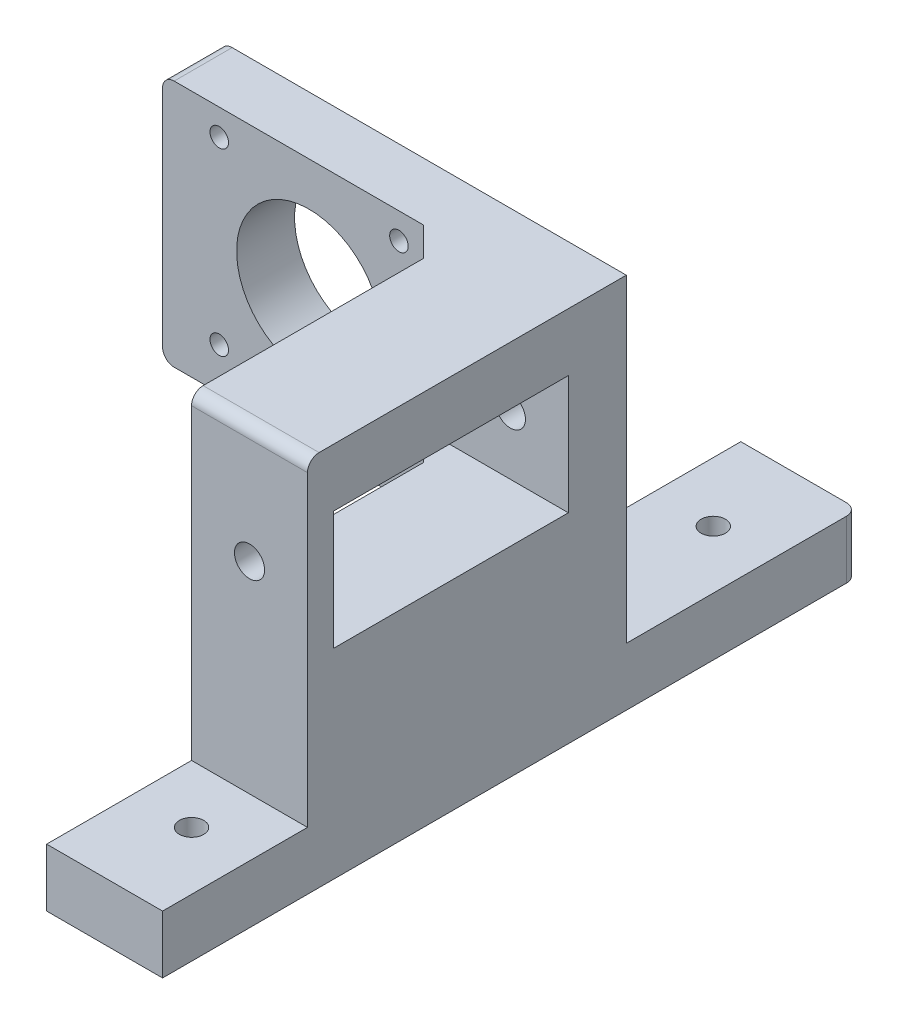
ISO-10303-21;
HEADER;
FILE_DESCRIPTION(('STEP AP214'),'2;1');
FILE_NAME('part.step','',(''),(''),'','','');
FILE_SCHEMA(('AUTOMOTIVE_DESIGN { 1 0 10303 214 1 1 1 1 }'));
ENDSEC;
DATA;
#1=APPLICATION_CONTEXT('core data for automotive mechanical design processes');
#2=APPLICATION_PROTOCOL_DEFINITION('international standard','automotive_design',2000,#1);
#3=PRODUCT_CONTEXT('',#1,'mechanical');
#4=PRODUCT('Part','Part','',(#3));
#5=PRODUCT_RELATED_PRODUCT_CATEGORY('part','',(#4));
#6=PRODUCT_DEFINITION_FORMATION('','',#4);
#7=PRODUCT_DEFINITION_CONTEXT('part definition',#1,'design');
#8=PRODUCT_DEFINITION('design','',#6,#7);
#9=PRODUCT_DEFINITION_SHAPE('','',#8);
#10=(LENGTH_UNIT() NAMED_UNIT(*) SI_UNIT(.MILLI.,.METRE.));
#11=(NAMED_UNIT(*) PLANE_ANGLE_UNIT() SI_UNIT($,.RADIAN.));
#12=(NAMED_UNIT(*) SI_UNIT($,.STERADIAN.) SOLID_ANGLE_UNIT());
#13=UNCERTAINTY_MEASURE_WITH_UNIT(LENGTH_MEASURE(1.E-05),#10,'distance_accuracy_value','');
#14=(GEOMETRIC_REPRESENTATION_CONTEXT(3) GLOBAL_UNCERTAINTY_ASSIGNED_CONTEXT((#13)) GLOBAL_UNIT_ASSIGNED_CONTEXT((#10,
#11,#12)) REPRESENTATION_CONTEXT('',''));
#15=CARTESIAN_POINT('',(0.,0.,0.));
#16=DIRECTION('',(0.,0.,1.));
#17=DIRECTION('',(1.,0.,0.));
#18=AXIS2_PLACEMENT_3D('',#15,#16,#17);
#19=CARTESIAN_POINT('',(20.,55.,-70.0000000000044));
#20=DIRECTION('',(0.,0.,-1.));
#21=DIRECTION('',(-1.,0.,0.));
#22=AXIS2_PLACEMENT_3D('',#19,#20,#21);
#23=PLANE('',#22);
#24=CARTESIAN_POINT('',(10.,44.75,-70.0000000000044));
#25=DIRECTION('',(0.,0.,-1.));
#26=DIRECTION('',(-1.,0.,0.));
#27=AXIS2_PLACEMENT_3D('',#24,#25,#26);
#28=CIRCLE('',#27,2.6);
#29=CARTESIAN_POINT('',(7.4,44.75,-70.0000000000044));
#30=VERTEX_POINT('',#29);
#31=EDGE_CURVE('E305',#30,#30,#28,.T.);
#32=ORIENTED_EDGE('',*,*,#31,.T.);
#33=EDGE_LOOP('',(#32));
#34=FACE_BOUND('',#33,.T.);
#35=CARTESIAN_POINT('',(-24.7252844500361,45.0002193563905,-70.0000000000044));
#36=DIRECTION('',(0.,0.,1.));
#37=DIRECTION('',(1.,0.,0.));
#38=AXIS2_PLACEMENT_3D('',#35,#36,#37);
#39=CIRCLE('',#38,12.5);
#40=CARTESIAN_POINT('',(-12.2252844500361,45.0002193563905,-70.0000000000044));
#41=VERTEX_POINT('',#40);
#42=EDGE_CURVE('E516',#41,#41,#39,.T.);
#43=ORIENTED_EDGE('',*,*,#42,.F.);
#44=EDGE_LOOP('',(#43));
#45=FACE_BOUND('',#44,.T.);
#46=CARTESIAN_POINT('',(-9.2252844500361,60.5002193563905,-70.0000000000044));
#47=DIRECTION('',(0.,0.,1.));
#48=DIRECTION('',(1.,0.,0.));
#49=AXIS2_PLACEMENT_3D('',#46,#47,#48);
#50=CIRCLE('',#49,1.6);
#51=CARTESIAN_POINT('',(-7.6252844500361,60.5002193563905,-70.0000000000044));
#52=VERTEX_POINT('',#51);
#53=EDGE_CURVE('E509',#52,#52,#50,.T.);
#54=ORIENTED_EDGE('',*,*,#53,.F.);
#55=EDGE_LOOP('',(#54));
#56=FACE_BOUND('',#55,.T.);
#57=CARTESIAN_POINT('',(-9.2252844500361,29.5002193563905,-70.0000000000044));
#58=DIRECTION('',(0.,0.,1.));
#59=DIRECTION('',(1.,0.,0.));
#60=AXIS2_PLACEMENT_3D('',#57,#58,#59);
#61=CIRCLE('',#60,1.6);
#62=CARTESIAN_POINT('',(-7.6252844500361,29.5002193563905,-70.0000000000044));
#63=VERTEX_POINT('',#62);
#64=EDGE_CURVE('E517',#63,#63,#61,.T.);
#65=ORIENTED_EDGE('',*,*,#64,.F.);
#66=EDGE_LOOP('',(#65));
#67=FACE_BOUND('',#66,.T.);
#68=CARTESIAN_POINT('',(-40.2252844500361,29.5002193563905,-70.0000000000044));
#69=DIRECTION('',(0.,0.,1.));
#70=DIRECTION('',(1.,0.,0.));
#71=AXIS2_PLACEMENT_3D('',#68,#69,#70);
#72=CIRCLE('',#71,1.6);
#73=CARTESIAN_POINT('',(-38.6252844500361,29.5002193563905,-70.0000000000044));
#74=VERTEX_POINT('',#73);
#75=EDGE_CURVE('E523',#74,#74,#72,.T.);
#76=ORIENTED_EDGE('',*,*,#75,.F.);
#77=EDGE_LOOP('',(#76));
#78=FACE_BOUND('',#77,.T.);
#79=CARTESIAN_POINT('',(-40.2252844500361,60.5002193563905,-70.0000000000044));
#80=DIRECTION('',(0.,0.,1.));
#81=DIRECTION('',(1.,0.,0.));
#82=AXIS2_PLACEMENT_3D('',#79,#80,#81);
#83=CIRCLE('',#82,1.6);
#84=CARTESIAN_POINT('',(-38.6252844500361,60.5002193563905,-70.0000000000044));
#85=VERTEX_POINT('',#84);
#86=EDGE_CURVE('E506',#85,#85,#83,.T.);
#87=ORIENTED_EDGE('',*,*,#86,.F.);
#88=EDGE_LOOP('',(#87));
#89=FACE_BOUND('',#88,.T.);
#90=DIRECTION('',(0.707106781186551,-0.707106781186544,0.));
#91=VECTOR('',#90,1.);
#92=CARTESIAN_POINT('',(-12.6249999999999,22.3749999999998,-70.0000000000044));
#93=LINE('',#92,#91);
#94=CARTESIAN_POINT('',(-12.5000000000001,22.25,-70.0000000000044));
#95=VERTEX_POINT('',#94);
#96=CARTESIAN_POINT('',(-5.00000000000003,14.75,-70.0000000000044));
#97=VERTEX_POINT('',#96);
#98=EDGE_CURVE('E310',#95,#97,#93,.T.);
#99=ORIENTED_EDGE('',*,*,#98,.T.);
#100=DIRECTION('',(0.,1.,0.));
#101=VECTOR('',#100,1.);
#102=CARTESIAN_POINT('',(-5.00000000000003,34.5,-70.0000000000044));
#103=LINE('',#102,#101);
#104=CARTESIAN_POINT('',(-5.00000000000003,34.5,-70.0000000000044));
#105=VERTEX_POINT('',#104);
#106=EDGE_CURVE('E208',#97,#105,#103,.T.);
#107=ORIENTED_EDGE('',*,*,#106,.T.);
#108=DIRECTION('',(-1.,0.,0.));
#109=VECTOR('',#108,1.);
#110=CARTESIAN_POINT('',(20.,34.5,-70.0000000000044));
#111=LINE('',#110,#109);
#112=CARTESIAN_POINT('',(20.,34.5,-70.0000000000044));
#113=VERTEX_POINT('',#112);
#114=EDGE_CURVE('E201',#113,#105,#111,.T.);
#115=ORIENTED_EDGE('',*,*,#114,.F.);
#116=DIRECTION('',(0.,-1.,0.));
#117=VECTOR('',#116,1.);
#118=CARTESIAN_POINT('',(20.,55.,-70.0000000000044));
#119=LINE('',#118,#117);
#120=CARTESIAN_POINT('',(20.,55.,-70.0000000000044));
#121=VERTEX_POINT('',#120);
#122=EDGE_CURVE('E205',#121,#113,#119,.T.);
#123=ORIENTED_EDGE('',*,*,#122,.F.);
#124=DIRECTION('',(-1.,0.,0.));
#125=VECTOR('',#124,1.);
#126=CARTESIAN_POINT('',(20.,55.,-70.0000000000044));
#127=LINE('',#126,#125);
#128=CARTESIAN_POINT('',(-5.00000000000003,55.,-70.0000000000044));
#129=VERTEX_POINT('',#128);
#130=EDGE_CURVE('E239',#121,#129,#127,.T.);
#131=ORIENTED_EDGE('',*,*,#130,.T.);
#132=DIRECTION('',(0.,1.,0.));
#133=VECTOR('',#132,1.);
#134=CARTESIAN_POINT('',(-5.00000000000003,65.,-70.0000000000044));
#135=LINE('',#134,#133);
#136=CARTESIAN_POINT('',(-5.00000000000003,65.,-70.0000000000044));
#137=VERTEX_POINT('',#136);
#138=EDGE_CURVE('E367',#129,#137,#135,.T.);
#139=ORIENTED_EDGE('',*,*,#138,.T.);
#140=DIRECTION('',(1.,0.,0.));
#141=VECTOR('',#140,1.);
#142=CARTESIAN_POINT('',(-50.,65.,-70.0000000000044));
#143=LINE('',#142,#141);
#144=CARTESIAN_POINT('',(-48.,65.,-70.0000000000044));
#145=VERTEX_POINT('',#144);
#146=EDGE_CURVE('E306',#145,#137,#143,.T.);
#147=ORIENTED_EDGE('',*,*,#146,.F.);
#148=CARTESIAN_POINT('',(-48.,63.,-70.0000000000044));
#149=DIRECTION('',(0.,0.,-1.));
#150=DIRECTION('',(-1.,0.,0.));
#151=AXIS2_PLACEMENT_3D('',#148,#149,#150);
#152=CIRCLE('',#151,2.);
#153=CARTESIAN_POINT('',(-50.,63.,-70.0000000000044));
#154=VERTEX_POINT('',#153);
#155=EDGE_CURVE('E361',#145,#154,#152,.F.);
#156=ORIENTED_EDGE('',*,*,#155,.T.);
#157=DIRECTION('',(0.,1.,0.));
#158=VECTOR('',#157,1.);
#159=CARTESIAN_POINT('',(-50.,65.,-70.0000000000044));
#160=LINE('',#159,#158);
#161=CARTESIAN_POINT('',(-50.,24.25,-70.0000000000044));
#162=VERTEX_POINT('',#161);
#163=EDGE_CURVE('E541',#162,#154,#160,.T.);
#164=ORIENTED_EDGE('',*,*,#163,.F.);
#165=CARTESIAN_POINT('',(-48.,24.25,-70.0000000000044));
#166=DIRECTION('',(0.,0.,-1.));
#167=DIRECTION('',(-1.,0.,0.));
#168=AXIS2_PLACEMENT_3D('',#165,#166,#167);
#169=CIRCLE('',#168,2.);
#170=CARTESIAN_POINT('',(-48.,22.25,-70.0000000000044));
#171=VERTEX_POINT('',#170);
#172=EDGE_CURVE('E359',#162,#171,#169,.F.);
#173=ORIENTED_EDGE('',*,*,#172,.T.);
#174=DIRECTION('',(1.,0.,0.));
#175=VECTOR('',#174,1.);
#176=CARTESIAN_POINT('',(-50.,22.25,-70.0000000000044));
#177=LINE('',#176,#175);
#178=EDGE_CURVE('E499',#171,#95,#177,.T.);
#179=ORIENTED_EDGE('',*,*,#178,.T.);
#180=EDGE_LOOP('',(#99,#107,#115,#123,#131,#139,#147,#156,#164,#173,#179));
#181=FACE_BOUND('',#180,.T.);
#182=ADVANCED_FACE('F45',(#34,#45,#56,#67,#78,#89,#181),#23,.F.);
#183=CARTESIAN_POINT('',(-50.,0.,0.));
#184=DIRECTION('',(-1.,0.,0.));
#185=DIRECTION('',(0.,0.,1.));
#186=AXIS2_PLACEMENT_3D('',#183,#184,#185);
#187=PLANE('',#186);
#188=ORIENTED_EDGE('',*,*,#163,.T.);
#189=DIRECTION('',(0.,0.,-1.));
#190=VECTOR('',#189,1.);
#191=CARTESIAN_POINT('',(-50.,63.,0.));
#192=LINE('',#191,#190);
#193=CARTESIAN_POINT('',(-50.,63.,-80.0000000000044));
#194=VERTEX_POINT('',#193);
#195=EDGE_CURVE('E352',#154,#194,#192,.T.);
#196=ORIENTED_EDGE('',*,*,#195,.T.);
#197=DIRECTION('',(0.,-1.,0.));
#198=VECTOR('',#197,1.);
#199=CARTESIAN_POINT('',(-50.,65.,-80.0000000000044));
#200=LINE('',#199,#198);
#201=CARTESIAN_POINT('',(-50.,24.25,-80.0000000000044));
#202=VERTEX_POINT('',#201);
#203=EDGE_CURVE('E538',#194,#202,#200,.T.);
#204=ORIENTED_EDGE('',*,*,#203,.T.);
#205=DIRECTION('',(0.,0.,1.));
#206=VECTOR('',#205,1.);
#207=CARTESIAN_POINT('',(-50.,24.25,0.));
#208=LINE('',#207,#206);
#209=EDGE_CURVE('E349',#202,#162,#208,.T.);
#210=ORIENTED_EDGE('',*,*,#209,.T.);
#211=EDGE_LOOP('',(#188,#196,#204,#210));
#212=FACE_BOUND('',#211,.T.);
#213=ADVANCED_FACE('F411',(#212),#187,.T.);
#214=CARTESIAN_POINT('',(0.,10.,0.));
#215=DIRECTION('',(1.,0.,0.));
#216=DIRECTION('',(0.,0.,-1.));
#217=AXIS2_PLACEMENT_3D('',#214,#215,#216);
#218=PLANE('',#217);
#219=DIRECTION('',(0.,0.,1.));
#220=VECTOR('',#219,1.);
#221=CARTESIAN_POINT('',(0.,34.5,-70.0000000000044));
#222=LINE('',#221,#220);
#223=CARTESIAN_POINT('',(0.,34.5,-65.0000000000044));
#224=VERTEX_POINT('',#223);
#225=CARTESIAN_POINT('',(0.,34.5,-29.5000000000044));
#226=VERTEX_POINT('',#225);
#227=EDGE_CURVE('E235',#224,#226,#222,.T.);
#228=ORIENTED_EDGE('',*,*,#227,.F.);
#229=DIRECTION('',(0.,-1.,0.));
#230=VECTOR('',#229,1.);
#231=CARTESIAN_POINT('',(0.,9.75000000000004,-65.0000000000044));
#232=LINE('',#231,#230);
#233=CARTESIAN_POINT('',(0.,9.75000000000004,-65.0000000000044));
#234=VERTEX_POINT('',#233);
#235=EDGE_CURVE('E373',#224,#234,#232,.T.);
#236=ORIENTED_EDGE('',*,*,#235,.T.);
#237=DIRECTION('',(0.,0.,-1.));
#238=VECTOR('',#237,1.);
#239=CARTESIAN_POINT('',(0.,9.75000000000004,0.));
#240=LINE('',#239,#238);
#241=CARTESIAN_POINT('',(0.,9.75000000000004,-118.));
#242=VERTEX_POINT('',#241);
#243=EDGE_CURVE('E61',#234,#242,#240,.T.);
#244=ORIENTED_EDGE('',*,*,#243,.T.);
#245=DIRECTION('',(0.,-1.,0.));
#246=VECTOR('',#245,1.);
#247=CARTESIAN_POINT('',(0.,10.,-118.));
#248=LINE('',#247,#246);
#249=CARTESIAN_POINT('',(0.,0.,-118.));
#250=VERTEX_POINT('',#249);
#251=EDGE_CURVE('E339',#242,#250,#248,.T.);
#252=ORIENTED_EDGE('',*,*,#251,.T.);
#253=DIRECTION('',(0.,0.,1.));
#254=VECTOR('',#253,1.);
#255=CARTESIAN_POINT('',(0.,0.,0.));
#256=LINE('',#255,#254);
#257=CARTESIAN_POINT('',(0.,0.,0.));
#258=VERTEX_POINT('',#257);
#259=EDGE_CURVE('E267',#250,#258,#256,.T.);
#260=ORIENTED_EDGE('',*,*,#259,.T.);
#261=DIRECTION('',(0.,-1.,0.));
#262=VECTOR('',#261,1.);
#263=CARTESIAN_POINT('',(0.,10.,0.));
#264=LINE('',#263,#262);
#265=CARTESIAN_POINT('',(0.,10.,0.));
#266=VERTEX_POINT('',#265);
#267=EDGE_CURVE('E298',#266,#258,#264,.T.);
#268=ORIENTED_EDGE('',*,*,#267,.F.);
#269=DIRECTION('',(0.,0.,1.));
#270=VECTOR('',#269,1.);
#271=CARTESIAN_POINT('',(0.,10.,0.));
#272=LINE('',#271,#270);
#273=CARTESIAN_POINT('',(0.,10.,-25.0000000000044));
#274=VERTEX_POINT('',#273);
#275=EDGE_CURVE('E276',#274,#266,#272,.T.);
#276=ORIENTED_EDGE('',*,*,#275,.F.);
#277=DIRECTION('',(0.,-1.,0.));
#278=VECTOR('',#277,1.);
#279=CARTESIAN_POINT('',(0.,65.,-25.0000000000044));
#280=LINE('',#279,#278);
#281=CARTESIAN_POINT('',(0.,63.,-25.0000000000044));
#282=VERTEX_POINT('',#281);
#283=EDGE_CURVE('E258',#282,#274,#280,.T.);
#284=ORIENTED_EDGE('',*,*,#283,.F.);
#285=CARTESIAN_POINT('',(0.,63.,-27.0000000000044));
#286=DIRECTION('',(1.,0.,0.));
#287=DIRECTION('',(0.,0.,-1.));
#288=AXIS2_PLACEMENT_3D('',#285,#286,#287);
#289=CIRCLE('',#288,2.);
#290=CARTESIAN_POINT('',(0.,65.,-27.0000000000044));
#291=VERTEX_POINT('',#290);
#292=EDGE_CURVE('E336',#282,#291,#289,.F.);
#293=ORIENTED_EDGE('',*,*,#292,.T.);
#294=DIRECTION('',(0.,0.,1.));
#295=VECTOR('',#294,1.);
#296=CARTESIAN_POINT('',(0.,65.,-25.0000000000044));
#297=LINE('',#296,#295);
#298=CARTESIAN_POINT('',(0.,65.,-65.0000000000044));
#299=VERTEX_POINT('',#298);
#300=EDGE_CURVE('E251',#299,#291,#297,.T.);
#301=ORIENTED_EDGE('',*,*,#300,.F.);
#302=DIRECTION('',(0.,-1.,0.));
#303=VECTOR('',#302,1.);
#304=CARTESIAN_POINT('',(0.,55.,-65.0000000000044));
#305=LINE('',#304,#303);
#306=CARTESIAN_POINT('',(0.,55.,-65.0000000000044));
#307=VERTEX_POINT('',#306);
#308=EDGE_CURVE('E371',#299,#307,#305,.T.);
#309=ORIENTED_EDGE('',*,*,#308,.T.);
#310=DIRECTION('',(0.,0.,-1.));
#311=VECTOR('',#310,1.);
#312=CARTESIAN_POINT('',(0.,55.,-70.0000000000044));
#313=LINE('',#312,#311);
#314=CARTESIAN_POINT('',(0.,55.,-29.5000000000044));
#315=VERTEX_POINT('',#314);
#316=EDGE_CURVE('E224',#315,#307,#313,.T.);
#317=ORIENTED_EDGE('',*,*,#316,.F.);
#318=DIRECTION('',(0.,1.,0.));
#319=VECTOR('',#318,1.);
#320=CARTESIAN_POINT('',(0.,55.,-29.5000000000044));
#321=LINE('',#320,#319);
#322=EDGE_CURVE('E227',#226,#315,#321,.T.);
#323=ORIENTED_EDGE('',*,*,#322,.F.);
#324=EDGE_LOOP('',(#228,#236,#244,#252,#260,#268,#276,#284,#293,#301,#309,#317,#323));
#325=FACE_BOUND('',#324,.T.);
#326=ADVANCED_FACE('F386',(#325),#218,.F.);
#327=CARTESIAN_POINT('',(0.,10.,0.));
#328=DIRECTION('',(0.,-1.,0.));
#329=DIRECTION('',(0.,0.,-1.));
#330=AXIS2_PLACEMENT_3D('',#327,#328,#329);
#331=PLANE('',#330);
#332=CARTESIAN_POINT('',(10.,10.,-15.));
#333=DIRECTION('',(0.,1.,0.));
#334=DIRECTION('',(0.,0.,1.));
#335=AXIS2_PLACEMENT_3D('',#332,#333,#334);
#336=CIRCLE('',#335,2.1);
#337=CARTESIAN_POINT('',(10.,10.,-12.9));
#338=VERTEX_POINT('',#337);
#339=EDGE_CURVE('E271',#338,#338,#336,.T.);
#340=ORIENTED_EDGE('',*,*,#339,.F.);
#341=EDGE_LOOP('',(#340));
#342=FACE_BOUND('',#341,.T.);
#343=DIRECTION('',(1.,0.,0.));
#344=VECTOR('',#343,1.);
#345=CARTESIAN_POINT('',(20.,10.,-25.0000000000044));
#346=LINE('',#345,#344);
#347=CARTESIAN_POINT('',(20.,10.,-25.0000000000044));
#348=VERTEX_POINT('',#347);
#349=EDGE_CURVE('E248',#274,#348,#346,.T.);
#350=ORIENTED_EDGE('',*,*,#349,.F.);
#351=ORIENTED_EDGE('',*,*,#275,.T.);
#352=DIRECTION('',(1.,0.,0.));
#353=VECTOR('',#352,1.);
#354=CARTESIAN_POINT('',(0.,10.,0.));
#355=LINE('',#354,#353);
#356=CARTESIAN_POINT('',(20.,10.,0.));
#357=VERTEX_POINT('',#356);
#358=EDGE_CURVE('E278',#266,#357,#355,.T.);
#359=ORIENTED_EDGE('',*,*,#358,.T.);
#360=DIRECTION('',(0.,0.,-1.));
#361=VECTOR('',#360,1.);
#362=CARTESIAN_POINT('',(20.,10.,0.));
#363=LINE('',#362,#361);
#364=EDGE_CURVE('E282',#357,#348,#363,.T.);
#365=ORIENTED_EDGE('',*,*,#364,.T.);
#366=EDGE_LOOP('',(#350,#351,#359,#365));
#367=FACE_BOUND('',#366,.T.);
#368=ADVANCED_FACE('F443',(#342,#367),#331,.F.);
#369=CARTESIAN_POINT('',(10.,10.,-105.));
#370=DIRECTION('',(0.,1.,0.));
#371=DIRECTION('',(0.,0.,1.));
#372=AXIS2_PLACEMENT_3D('',#369,#370,#371);
#373=CIRCLE('',#372,2.10000000000001);
#374=CARTESIAN_POINT('',(10.,10.,-102.9));
#375=VERTEX_POINT('',#374);
#376=EDGE_CURVE('E268',#375,#375,#373,.T.);
#377=ORIENTED_EDGE('',*,*,#376,.F.);
#378=EDGE_LOOP('',(#377));
#379=FACE_BOUND('',#378,.T.);
#380=CARTESIAN_POINT('',(20.,10.,-80.0000000000044));
#381=VERTEX_POINT('',#380);
#382=CARTESIAN_POINT('',(20.,10.,-118.));
#383=VERTEX_POINT('',#382);
#384=EDGE_CURVE('E281',#381,#383,#363,.T.);
#385=ORIENTED_EDGE('',*,*,#384,.T.);
#386=CARTESIAN_POINT('',(18.,10.,-118.));
#387=DIRECTION('',(0.,-1.,0.));
#388=DIRECTION('',(0.,0.,-1.));
#389=AXIS2_PLACEMENT_3D('',#386,#387,#388);
#390=CIRCLE('',#389,2.);
#391=CARTESIAN_POINT('',(18.,10.,-120.));
#392=VERTEX_POINT('',#391);
#393=EDGE_CURVE('E334',#383,#392,#390,.F.);
#394=ORIENTED_EDGE('',*,*,#393,.T.);
#395=DIRECTION('',(-1.,0.,0.));
#396=VECTOR('',#395,1.);
#397=CARTESIAN_POINT('',(0.,10.,-120.));
#398=LINE('',#397,#396);
#399=CARTESIAN_POINT('',(-0.249999999999963,10.,-120.));
#400=VERTEX_POINT('',#399);
#401=EDGE_CURVE('E285',#392,#400,#398,.T.);
#402=ORIENTED_EDGE('',*,*,#401,.T.);
#403=DIRECTION('',(0.,0.,1.));
#404=VECTOR('',#403,1.);
#405=CARTESIAN_POINT('',(-0.249999999999964,10.,0.));
#406=LINE('',#405,#404);
#407=CARTESIAN_POINT('',(-0.249999999999962,10.,-80.0000000000044));
#408=VERTEX_POINT('',#407);
#409=EDGE_CURVE('E315',#400,#408,#406,.T.);
#410=ORIENTED_EDGE('',*,*,#409,.T.);
#411=DIRECTION('',(-1.,0.,0.));
#412=VECTOR('',#411,1.);
#413=CARTESIAN_POINT('',(20.,10.,-80.0000000000044));
#414=LINE('',#413,#412);
#415=EDGE_CURVE('E241',#381,#408,#414,.T.);
#416=ORIENTED_EDGE('',*,*,#415,.F.);
#417=EDGE_LOOP('',(#385,#394,#402,#410,#416));
#418=FACE_BOUND('',#417,.T.);
#419=ADVANCED_FACE('F445',(#379,#418),#331,.F.);
#420=CARTESIAN_POINT('',(0.,10.,0.));
#421=DIRECTION('',(0.,0.,-1.));
#422=DIRECTION('',(-1.,0.,0.));
#423=AXIS2_PLACEMENT_3D('',#420,#421,#422);
#424=PLANE('',#423);
#425=DIRECTION('',(1.,0.,0.));
#426=VECTOR('',#425,1.);
#427=CARTESIAN_POINT('',(0.,0.,0.));
#428=LINE('',#427,#426);
#429=CARTESIAN_POINT('',(20.,0.,0.));
#430=VERTEX_POINT('',#429);
#431=EDGE_CURVE('E289',#258,#430,#428,.T.);
#432=ORIENTED_EDGE('',*,*,#431,.T.);
#433=DIRECTION('',(0.,-1.,0.));
#434=VECTOR('',#433,1.);
#435=CARTESIAN_POINT('',(20.,10.,0.));
#436=LINE('',#435,#434);
#437=EDGE_CURVE('E287',#357,#430,#436,.T.);
#438=ORIENTED_EDGE('',*,*,#437,.F.);
#439=ORIENTED_EDGE('',*,*,#358,.F.);
#440=ORIENTED_EDGE('',*,*,#267,.T.);
#441=EDGE_LOOP('',(#432,#438,#439,#440));
#442=FACE_BOUND('',#441,.T.);
#443=ADVANCED_FACE('F456',(#442),#424,.F.);
#444=CARTESIAN_POINT('',(20.,10.,0.));
#445=DIRECTION('',(-1.,0.,0.));
#446=DIRECTION('',(0.,0.,1.));
#447=AXIS2_PLACEMENT_3D('',#444,#445,#446);
#448=PLANE('',#447);
#449=DIRECTION('',(0.,0.,-1.));
#450=VECTOR('',#449,1.);
#451=CARTESIAN_POINT('',(20.,55.,-70.0000000000044));
#452=LINE('',#451,#450);
#453=CARTESIAN_POINT('',(20.,55.,-29.5000000000044));
#454=VERTEX_POINT('',#453);
#455=EDGE_CURVE('E210',#454,#121,#452,.T.);
#456=ORIENTED_EDGE('',*,*,#455,.T.);
#457=ORIENTED_EDGE('',*,*,#122,.T.);
#458=DIRECTION('',(0.,0.,1.));
#459=VECTOR('',#458,1.);
#460=CARTESIAN_POINT('',(20.,34.5,-70.0000000000044));
#461=LINE('',#460,#459);
#462=CARTESIAN_POINT('',(20.,34.5,-29.5000000000044));
#463=VERTEX_POINT('',#462);
#464=EDGE_CURVE('E214',#113,#463,#461,.T.);
#465=ORIENTED_EDGE('',*,*,#464,.T.);
#466=DIRECTION('',(0.,1.,0.));
#467=VECTOR('',#466,1.);
#468=CARTESIAN_POINT('',(20.,55.,-29.5000000000044));
#469=LINE('',#468,#467);
#470=EDGE_CURVE('E219',#463,#454,#469,.T.);
#471=ORIENTED_EDGE('',*,*,#470,.T.);
#472=EDGE_LOOP('',(#456,#457,#465,#471));
#473=FACE_BOUND('',#472,.T.);
#474=DIRECTION('',(0.,0.,-1.));
#475=VECTOR('',#474,1.);
#476=CARTESIAN_POINT('',(20.,0.,0.));
#477=LINE('',#476,#475);
#478=CARTESIAN_POINT('',(20.,0.,-118.));
#479=VERTEX_POINT('',#478);
#480=EDGE_CURVE('E291',#430,#479,#477,.T.);
#481=ORIENTED_EDGE('',*,*,#480,.T.);
#482=DIRECTION('',(0.,-1.,0.));
#483=VECTOR('',#482,1.);
#484=CARTESIAN_POINT('',(20.,10.,-118.));
#485=LINE('',#484,#483);
#486=EDGE_CURVE('E332',#479,#383,#485,.F.);
#487=ORIENTED_EDGE('',*,*,#486,.T.);
#488=ORIENTED_EDGE('',*,*,#384,.F.);
#489=DIRECTION('',(0.,-1.,0.));
#490=VECTOR('',#489,1.);
#491=CARTESIAN_POINT('',(20.,65.,-80.0000000000044));
#492=LINE('',#491,#490);
#493=CARTESIAN_POINT('',(20.,65.,-80.0000000000044));
#494=VERTEX_POINT('',#493);
#495=EDGE_CURVE('E260',#494,#381,#492,.T.);
#496=ORIENTED_EDGE('',*,*,#495,.F.);
#497=DIRECTION('',(0.,0.,-1.));
#498=VECTOR('',#497,1.);
#499=CARTESIAN_POINT('',(20.,65.,-25.0000000000044));
#500=LINE('',#499,#498);
#501=CARTESIAN_POINT('',(20.,65.,-27.0000000000044));
#502=VERTEX_POINT('',#501);
#503=EDGE_CURVE('E245',#502,#494,#500,.T.);
#504=ORIENTED_EDGE('',*,*,#503,.F.);
#505=CARTESIAN_POINT('',(20.,63.,-27.0000000000044));
#506=DIRECTION('',(-1.,0.,0.));
#507=DIRECTION('',(0.,0.,1.));
#508=AXIS2_PLACEMENT_3D('',#505,#506,#507);
#509=CIRCLE('',#508,2.);
#510=CARTESIAN_POINT('',(20.,63.,-25.0000000000044));
#511=VERTEX_POINT('',#510);
#512=EDGE_CURVE('E330',#502,#511,#509,.F.);
#513=ORIENTED_EDGE('',*,*,#512,.T.);
#514=DIRECTION('',(0.,-1.,0.));
#515=VECTOR('',#514,1.);
#516=CARTESIAN_POINT('',(20.,65.,-25.0000000000044));
#517=LINE('',#516,#515);
#518=EDGE_CURVE('E253',#511,#348,#517,.T.);
#519=ORIENTED_EDGE('',*,*,#518,.T.);
#520=ORIENTED_EDGE('',*,*,#364,.F.);
#521=ORIENTED_EDGE('',*,*,#437,.T.);
#522=EDGE_LOOP('',(#481,#487,#488,#496,#504,#513,#519,#520,#521));
#523=FACE_BOUND('',#522,.T.);
#524=ADVANCED_FACE('F221',(#473,#523),#448,.F.);
#525=CARTESIAN_POINT('',(0.,10.,-120.));
#526=DIRECTION('',(0.,0.,1.));
#527=DIRECTION('',(1.,0.,0.));
#528=AXIS2_PLACEMENT_3D('',#525,#526,#527);
#529=PLANE('',#528);
#530=ORIENTED_EDGE('',*,*,#401,.F.);
#531=DIRECTION('',(0.,-1.,0.));
#532=VECTOR('',#531,1.);
#533=CARTESIAN_POINT('',(18.,10.,-120.));
#534=LINE('',#533,#532);
#535=CARTESIAN_POINT('',(18.,0.,-120.));
#536=VERTEX_POINT('',#535);
#537=EDGE_CURVE('E323',#392,#536,#534,.T.);
#538=ORIENTED_EDGE('',*,*,#537,.T.);
#539=DIRECTION('',(-1.,0.,0.));
#540=VECTOR('',#539,1.);
#541=CARTESIAN_POINT('',(0.,0.,-120.));
#542=LINE('',#541,#540);
#543=CARTESIAN_POINT('',(2.,0.,-120.));
#544=VERTEX_POINT('',#543);
#545=EDGE_CURVE('E279',#536,#544,#542,.T.);
#546=ORIENTED_EDGE('',*,*,#545,.T.);
#547=DIRECTION('',(0.,-1.,0.));
#548=VECTOR('',#547,1.);
#549=CARTESIAN_POINT('',(2.,10.,-120.));
#550=LINE('',#549,#548);
#551=CARTESIAN_POINT('',(2.,7.75000000000006,-120.));
#552=VERTEX_POINT('',#551);
#553=EDGE_CURVE('E320',#544,#552,#550,.F.);
#554=ORIENTED_EDGE('',*,*,#553,.T.);
#555=DIRECTION('',(-0.707106781186551,0.707106781186544,0.));
#556=VECTOR('',#555,1.);
#557=CARTESIAN_POINT('',(-0.12499999999998,9.87500000000002,-120.));
#558=LINE('',#557,#556);
#559=EDGE_CURVE('E312',#552,#400,#558,.T.);
#560=ORIENTED_EDGE('',*,*,#559,.T.);
#561=EDGE_LOOP('',(#530,#538,#546,#554,#560));
#562=FACE_BOUND('',#561,.T.);
#563=ADVANCED_FACE('F449',(#562),#529,.F.);
#564=CARTESIAN_POINT('',(0.,0.,0.));
#565=DIRECTION('',(0.,-1.,0.));
#566=DIRECTION('',(0.,0.,-1.));
#567=AXIS2_PLACEMENT_3D('',#564,#565,#566);
#568=PLANE('',#567);
#569=CARTESIAN_POINT('',(10.,0.,-105.));
#570=DIRECTION('',(0.,1.,0.));
#571=DIRECTION('',(0.,0.,1.));
#572=AXIS2_PLACEMENT_3D('',#569,#570,#571);
#573=CIRCLE('',#572,2.10000000000001);
#574=CARTESIAN_POINT('',(10.,0.,-102.9));
#575=VERTEX_POINT('',#574);
#576=EDGE_CURVE('E264',#575,#575,#573,.T.);
#577=ORIENTED_EDGE('',*,*,#576,.T.);
#578=EDGE_LOOP('',(#577));
#579=FACE_BOUND('',#578,.T.);
#580=CARTESIAN_POINT('',(10.,0.,-15.));
#581=DIRECTION('',(0.,1.,0.));
#582=DIRECTION('',(0.,0.,1.));
#583=AXIS2_PLACEMENT_3D('',#580,#581,#582);
#584=CIRCLE('',#583,2.1);
#585=CARTESIAN_POINT('',(10.,0.,-12.9));
#586=VERTEX_POINT('',#585);
#587=EDGE_CURVE('E263',#586,#586,#584,.T.);
#588=ORIENTED_EDGE('',*,*,#587,.T.);
#589=EDGE_LOOP('',(#588));
#590=FACE_BOUND('',#589,.T.);
#591=ORIENTED_EDGE('',*,*,#545,.F.);
#592=CARTESIAN_POINT('',(18.,0.,-118.));
#593=DIRECTION('',(0.,-1.,0.));
#594=DIRECTION('',(0.,0.,-1.));
#595=AXIS2_PLACEMENT_3D('',#592,#593,#594);
#596=CIRCLE('',#595,2.);
#597=EDGE_CURVE('E328',#536,#479,#596,.T.);
#598=ORIENTED_EDGE('',*,*,#597,.T.);
#599=ORIENTED_EDGE('',*,*,#480,.F.);
#600=ORIENTED_EDGE('',*,*,#431,.F.);
#601=ORIENTED_EDGE('',*,*,#259,.F.);
#602=CARTESIAN_POINT('',(2.,0.,-118.));
#603=DIRECTION('',(0.,-1.,0.));
#604=DIRECTION('',(0.,0.,-1.));
#605=AXIS2_PLACEMENT_3D('',#602,#603,#604);
#606=CIRCLE('',#605,2.);
#607=EDGE_CURVE('E326',#250,#544,#606,.T.);
#608=ORIENTED_EDGE('',*,*,#607,.T.);
#609=EDGE_LOOP('',(#591,#598,#599,#600,#601,#608));
#610=FACE_BOUND('',#609,.T.);
#611=ADVANCED_FACE('F441',(#579,#590,#610),#568,.T.);
#612=CARTESIAN_POINT('',(10.,0.,-15.));
#613=DIRECTION('',(0.,1.,0.));
#614=DIRECTION('',(0.,0.,1.));
#615=AXIS2_PLACEMENT_3D('',#612,#613,#614);
#616=CYLINDRICAL_SURFACE('',#615,2.1);
#617=ORIENTED_EDGE('',*,*,#587,.F.);
#618=EDGE_LOOP('',(#617));
#619=FACE_BOUND('',#618,.T.);
#620=ORIENTED_EDGE('',*,*,#339,.T.);
#621=EDGE_LOOP('',(#620));
#622=FACE_BOUND('',#621,.T.);
#623=ADVANCED_FACE('F437',(#619,#622),#616,.F.);
#624=CARTESIAN_POINT('',(10.,0.,-105.));
#625=DIRECTION('',(0.,1.,0.));
#626=DIRECTION('',(0.,0.,1.));
#627=AXIS2_PLACEMENT_3D('',#624,#625,#626);
#628=CYLINDRICAL_SURFACE('',#627,2.10000000000001);
#629=ORIENTED_EDGE('',*,*,#576,.F.);
#630=EDGE_LOOP('',(#629));
#631=FACE_BOUND('',#630,.T.);
#632=ORIENTED_EDGE('',*,*,#376,.T.);
#633=EDGE_LOOP('',(#632));
#634=FACE_BOUND('',#633,.T.);
#635=ADVANCED_FACE('F433',(#631,#634),#628,.F.);
#636=CARTESIAN_POINT('',(20.,65.,-80.0000000000044));
#637=DIRECTION('',(0.,0.,1.));
#638=DIRECTION('',(1.,0.,0.));
#639=AXIS2_PLACEMENT_3D('',#636,#637,#638);
#640=PLANE('',#639);
#641=CARTESIAN_POINT('',(-40.2252844500361,60.5002193563905,-80.0000000000044));
#642=DIRECTION('',(0.,0.,1.));
#643=DIRECTION('',(1.,0.,0.));
#644=AXIS2_PLACEMENT_3D('',#641,#642,#643);
#645=CIRCLE('',#644,1.6);
#646=CARTESIAN_POINT('',(-38.6252844500361,60.5002193563905,-80.0000000000044));
#647=VERTEX_POINT('',#646);
#648=EDGE_CURVE('E526',#647,#647,#645,.F.);
#649=ORIENTED_EDGE('',*,*,#648,.F.);
#650=EDGE_LOOP('',(#649));
#651=FACE_BOUND('',#650,.T.);
#652=CARTESIAN_POINT('',(-40.2252844500361,29.5002193563905,-80.0000000000044));
#653=DIRECTION('',(0.,0.,1.));
#654=DIRECTION('',(1.,0.,0.));
#655=AXIS2_PLACEMENT_3D('',#652,#653,#654);
#656=CIRCLE('',#655,1.6);
#657=CARTESIAN_POINT('',(-38.6252844500361,29.5002193563905,-80.0000000000044));
#658=VERTEX_POINT('',#657);
#659=EDGE_CURVE('E520',#658,#658,#656,.F.);
#660=ORIENTED_EDGE('',*,*,#659,.F.);
#661=EDGE_LOOP('',(#660));
#662=FACE_BOUND('',#661,.T.);
#663=CARTESIAN_POINT('',(-9.2252844500361,29.5002193563905,-80.0000000000044));
#664=DIRECTION('',(0.,0.,1.));
#665=DIRECTION('',(1.,0.,0.));
#666=AXIS2_PLACEMENT_3D('',#663,#664,#665);
#667=CIRCLE('',#666,1.6);
#668=CARTESIAN_POINT('',(-7.6252844500361,29.5002193563905,-80.0000000000044));
#669=VERTEX_POINT('',#668);
#670=EDGE_CURVE('E513',#669,#669,#667,.F.);
#671=ORIENTED_EDGE('',*,*,#670,.F.);
#672=EDGE_LOOP('',(#671));
#673=FACE_BOUND('',#672,.T.);
#674=CARTESIAN_POINT('',(-9.2252844500361,60.5002193563905,-80.0000000000044));
#675=DIRECTION('',(0.,0.,1.));
#676=DIRECTION('',(1.,0.,0.));
#677=AXIS2_PLACEMENT_3D('',#674,#675,#676);
#678=CIRCLE('',#677,1.6);
#679=CARTESIAN_POINT('',(-7.6252844500361,60.5002193563905,-80.0000000000044));
#680=VERTEX_POINT('',#679);
#681=EDGE_CURVE('E512',#680,#680,#678,.F.);
#682=ORIENTED_EDGE('',*,*,#681,.F.);
#683=EDGE_LOOP('',(#682));
#684=FACE_BOUND('',#683,.T.);
#685=CARTESIAN_POINT('',(-24.7252844500361,45.0002193563905,-80.0000000000044));
#686=DIRECTION('',(0.,0.,1.));
#687=DIRECTION('',(1.,0.,0.));
#688=AXIS2_PLACEMENT_3D('',#685,#686,#687);
#689=CIRCLE('',#688,12.5);
#690=CARTESIAN_POINT('',(-12.2252844500361,45.0002193563905,-80.0000000000044));
#691=VERTEX_POINT('',#690);
#692=EDGE_CURVE('E535',#691,#691,#689,.F.);
#693=ORIENTED_EDGE('',*,*,#692,.F.);
#694=EDGE_LOOP('',(#693));
#695=FACE_BOUND('',#694,.T.);
#696=CARTESIAN_POINT('',(10.,44.75,-80.0000000000044));
#697=DIRECTION('',(0.,0.,1.));
#698=DIRECTION('',(1.,0.,0.));
#699=AXIS2_PLACEMENT_3D('',#696,#697,#698);
#700=CIRCLE('',#699,2.6);
#701=CARTESIAN_POINT('',(12.6,44.75,-80.0000000000044));
#702=VERTEX_POINT('',#701);
#703=EDGE_CURVE('E230',#702,#702,#700,.T.);
#704=ORIENTED_EDGE('',*,*,#703,.T.);
#705=EDGE_LOOP('',(#704));
#706=FACE_BOUND('',#705,.T.);
#707=ORIENTED_EDGE('',*,*,#203,.F.);
#708=CARTESIAN_POINT('',(-48.,63.,-80.0000000000044));
#709=DIRECTION('',(0.,0.,1.));
#710=DIRECTION('',(1.,0.,0.));
#711=AXIS2_PLACEMENT_3D('',#708,#709,#710);
#712=CIRCLE('',#711,2.);
#713=CARTESIAN_POINT('',(-48.,65.,-80.0000000000044));
#714=VERTEX_POINT('',#713);
#715=EDGE_CURVE('E357',#194,#714,#712,.F.);
#716=ORIENTED_EDGE('',*,*,#715,.T.);
#717=DIRECTION('',(-1.,0.,0.));
#718=VECTOR('',#717,1.);
#719=CARTESIAN_POINT('',(20.,65.,-80.0000000000044));
#720=LINE('',#719,#718);
#721=EDGE_CURVE('E247',#494,#714,#720,.T.);
#722=ORIENTED_EDGE('',*,*,#721,.F.);
#723=ORIENTED_EDGE('',*,*,#495,.T.);
#724=ORIENTED_EDGE('',*,*,#415,.T.);
#725=DIRECTION('',(-0.707106781186551,0.707106781186544,0.));
#726=VECTOR('',#725,1.);
#727=CARTESIAN_POINT('',(-17.6249999999999,27.3749999999997,-80.0000000000044));
#728=LINE('',#727,#726);
#729=CARTESIAN_POINT('',(-12.5000000000001,22.25,-80.0000000000044));
#730=VERTEX_POINT('',#729);
#731=EDGE_CURVE('E318',#408,#730,#728,.T.);
#732=ORIENTED_EDGE('',*,*,#731,.T.);
#733=DIRECTION('',(-1.,0.,0.));
#734=VECTOR('',#733,1.);
#735=CARTESIAN_POINT('',(-50.,22.25,-80.0000000000044));
#736=LINE('',#735,#734);
#737=CARTESIAN_POINT('',(-48.,22.25,-80.0000000000044));
#738=VERTEX_POINT('',#737);
#739=EDGE_CURVE('E503',#730,#738,#736,.T.);
#740=ORIENTED_EDGE('',*,*,#739,.T.);
#741=CARTESIAN_POINT('',(-48.,24.25,-80.0000000000044));
#742=DIRECTION('',(0.,0.,1.));
#743=DIRECTION('',(1.,0.,0.));
#744=AXIS2_PLACEMENT_3D('',#741,#742,#743);
#745=CIRCLE('',#744,2.);
#746=EDGE_CURVE('E355',#738,#202,#745,.F.);
#747=ORIENTED_EDGE('',*,*,#746,.T.);
#748=EDGE_LOOP('',(#707,#716,#722,#723,#724,#732,#740,#747));
#749=FACE_BOUND('',#748,.T.);
#750=ADVANCED_FACE('F429',(#651,#662,#673,#684,#695,#706,#749),#640,.F.);
#751=CARTESIAN_POINT('',(20.,65.,-25.0000000000044));
#752=DIRECTION('',(0.,0.,-1.));
#753=DIRECTION('',(-1.,0.,0.));
#754=AXIS2_PLACEMENT_3D('',#751,#752,#753);
#755=PLANE('',#754);
#756=CARTESIAN_POINT('',(10.,44.75,-25.0000000000044));
#757=DIRECTION('',(0.,0.,-1.));
#758=DIRECTION('',(-1.,0.,0.));
#759=AXIS2_PLACEMENT_3D('',#756,#757,#758);
#760=CIRCLE('',#759,2.6);
#761=CARTESIAN_POINT('',(7.4,44.75,-25.0000000000044));
#762=VERTEX_POINT('',#761);
#763=EDGE_CURVE('E545',#762,#762,#760,.T.);
#764=ORIENTED_EDGE('',*,*,#763,.T.);
#765=EDGE_LOOP('',(#764));
#766=FACE_BOUND('',#765,.T.);
#767=ORIENTED_EDGE('',*,*,#518,.F.);
#768=DIRECTION('',(1.,0.,0.));
#769=VECTOR('',#768,1.);
#770=CARTESIAN_POINT('',(0.,63.,-25.0000000000044));
#771=LINE('',#770,#769);
#772=EDGE_CURVE('E347',#511,#282,#771,.F.);
#773=ORIENTED_EDGE('',*,*,#772,.T.);
#774=ORIENTED_EDGE('',*,*,#283,.T.);
#775=ORIENTED_EDGE('',*,*,#349,.T.);
#776=EDGE_LOOP('',(#767,#773,#774,#775));
#777=FACE_BOUND('',#776,.T.);
#778=ADVANCED_FACE('F426',(#766,#777),#755,.F.);
#779=CARTESIAN_POINT('',(0.,65.,0.));
#780=DIRECTION('',(0.,1.,0.));
#781=DIRECTION('',(0.,0.,1.));
#782=AXIS2_PLACEMENT_3D('',#779,#780,#781);
#783=PLANE('',#782);
#784=ORIENTED_EDGE('',*,*,#146,.T.);
#785=DIRECTION('',(-0.707106781186551,0.,-0.707106781186544));
#786=VECTOR('',#785,1.);
#787=CARTESIAN_POINT('',(-5.00000000000003,65.,-70.0000000000044));
#788=LINE('',#787,#786);
#789=EDGE_CURVE('E54',#137,#299,#788,.F.);
#790=ORIENTED_EDGE('',*,*,#789,.T.);
#791=ORIENTED_EDGE('',*,*,#300,.T.);
#792=DIRECTION('',(1.,0.,0.));
#793=VECTOR('',#792,1.);
#794=CARTESIAN_POINT('',(20.,65.,-27.0000000000044));
#795=LINE('',#794,#793);
#796=EDGE_CURVE('E344',#291,#502,#795,.T.);
#797=ORIENTED_EDGE('',*,*,#796,.T.);
#798=ORIENTED_EDGE('',*,*,#503,.T.);
#799=ORIENTED_EDGE('',*,*,#721,.T.);
#800=DIRECTION('',(0.,0.,-1.));
#801=VECTOR('',#800,1.);
#802=CARTESIAN_POINT('',(-48.,65.,0.));
#803=LINE('',#802,#801);
#804=EDGE_CURVE('E342',#714,#145,#803,.F.);
#805=ORIENTED_EDGE('',*,*,#804,.T.);
#806=EDGE_LOOP('',(#784,#790,#791,#797,#798,#799,#805));
#807=FACE_BOUND('',#806,.T.);
#808=ADVANCED_FACE('F380',(#807),#783,.T.);
#809=CARTESIAN_POINT('',(20.,55.,-70.0000000000044));
#810=DIRECTION('',(0.,1.,0.));
#811=DIRECTION('',(0.,0.,1.));
#812=AXIS2_PLACEMENT_3D('',#809,#810,#811);
#813=PLANE('',#812);
#814=ORIENTED_EDGE('',*,*,#316,.T.);
#815=DIRECTION('',(0.707106781186551,0.,0.707106781186544));
#816=VECTOR('',#815,1.);
#817=CARTESIAN_POINT('',(7.50000000000012,55.,-57.5000000000044));
#818=LINE('',#817,#816);
#819=EDGE_CURVE('E11',#307,#129,#818,.F.);
#820=ORIENTED_EDGE('',*,*,#819,.T.);
#821=ORIENTED_EDGE('',*,*,#130,.F.);
#822=ORIENTED_EDGE('',*,*,#455,.F.);
#823=DIRECTION('',(-1.,0.,0.));
#824=VECTOR('',#823,1.);
#825=CARTESIAN_POINT('',(20.,55.,-29.5000000000044));
#826=LINE('',#825,#824);
#827=EDGE_CURVE('E242',#454,#315,#826,.T.);
#828=ORIENTED_EDGE('',*,*,#827,.T.);
#829=EDGE_LOOP('',(#814,#820,#821,#822,#828));
#830=FACE_BOUND('',#829,.T.);
#831=ADVANCED_FACE('F393',(#830),#813,.F.);
#832=CARTESIAN_POINT('',(20.,55.,-29.5000000000044));
#833=DIRECTION('',(0.,0.,1.));
#834=DIRECTION('',(1.,0.,0.));
#835=AXIS2_PLACEMENT_3D('',#832,#833,#834);
#836=PLANE('',#835);
#837=CARTESIAN_POINT('',(10.,44.75,-29.5000000000044));
#838=DIRECTION('',(0.,0.,1.));
#839=DIRECTION('',(1.,0.,0.));
#840=AXIS2_PLACEMENT_3D('',#837,#838,#839);
#841=CIRCLE('',#840,2.6);
#842=CARTESIAN_POINT('',(12.6,44.75,-29.5000000000044));
#843=VERTEX_POINT('',#842);
#844=EDGE_CURVE('E302',#843,#843,#841,.T.);
#845=ORIENTED_EDGE('',*,*,#844,.T.);
#846=EDGE_LOOP('',(#845));
#847=FACE_BOUND('',#846,.T.);
#848=ORIENTED_EDGE('',*,*,#322,.T.);
#849=ORIENTED_EDGE('',*,*,#827,.F.);
#850=ORIENTED_EDGE('',*,*,#470,.F.);
#851=DIRECTION('',(-1.,0.,0.));
#852=VECTOR('',#851,1.);
#853=CARTESIAN_POINT('',(20.,34.5,-29.5000000000044));
#854=LINE('',#853,#852);
#855=EDGE_CURVE('E209',#463,#226,#854,.T.);
#856=ORIENTED_EDGE('',*,*,#855,.T.);
#857=EDGE_LOOP('',(#848,#849,#850,#856));
#858=FACE_BOUND('',#857,.T.);
#859=ADVANCED_FACE('F397',(#847,#858),#836,.F.);
#860=CARTESIAN_POINT('',(20.,34.5,-70.0000000000044));
#861=DIRECTION('',(0.,-1.,0.));
#862=DIRECTION('',(0.,0.,-1.));
#863=AXIS2_PLACEMENT_3D('',#860,#861,#862);
#864=PLANE('',#863);
#865=ORIENTED_EDGE('',*,*,#114,.T.);
#866=DIRECTION('',(-0.707106781186551,0.,-0.707106781186544));
#867=VECTOR('',#866,1.);
#868=CARTESIAN_POINT('',(7.50000000000012,34.5,-57.5000000000044));
#869=LINE('',#868,#867);
#870=EDGE_CURVE('E69',#105,#224,#869,.F.);
#871=ORIENTED_EDGE('',*,*,#870,.T.);
#872=ORIENTED_EDGE('',*,*,#227,.T.);
#873=ORIENTED_EDGE('',*,*,#855,.F.);
#874=ORIENTED_EDGE('',*,*,#464,.F.);
#875=EDGE_LOOP('',(#865,#871,#872,#873,#874));
#876=FACE_BOUND('',#875,.T.);
#877=ADVANCED_FACE('F215',(#876),#864,.F.);
#878=CARTESIAN_POINT('',(10.,44.75,-120.000000000004));
#879=DIRECTION('',(0.,0.,1.));
#880=DIRECTION('',(1.,0.,0.));
#881=AXIS2_PLACEMENT_3D('',#878,#879,#880);
#882=CYLINDRICAL_SURFACE('',#881,2.6);
#883=ORIENTED_EDGE('',*,*,#844,.F.);
#884=EDGE_LOOP('',(#883));
#885=FACE_BOUND('',#884,.T.);
#886=ORIENTED_EDGE('',*,*,#763,.F.);
#887=EDGE_LOOP('',(#886));
#888=FACE_BOUND('',#887,.T.);
#889=ADVANCED_FACE('F406',(#885,#888),#882,.F.);
#890=ORIENTED_EDGE('',*,*,#31,.F.);
#891=EDGE_LOOP('',(#890));
#892=FACE_BOUND('',#891,.T.);
#893=ORIENTED_EDGE('',*,*,#703,.F.);
#894=EDGE_LOOP('',(#893));
#895=FACE_BOUND('',#894,.T.);
#896=ADVANCED_FACE('F553',(#892,#895),#882,.F.);
#897=CARTESIAN_POINT('',(-24.7252844500361,45.0002193563905,-115.355339059332));
#898=DIRECTION('',(0.,0.,1.));
#899=DIRECTION('',(1.,0.,0.));
#900=AXIS2_PLACEMENT_3D('',#897,#898,#899);
#901=CYLINDRICAL_SURFACE('',#900,12.5);
#902=ORIENTED_EDGE('',*,*,#692,.T.);
#903=EDGE_LOOP('',(#902));
#904=FACE_BOUND('',#903,.T.);
#905=ORIENTED_EDGE('',*,*,#42,.T.);
#906=EDGE_LOOP('',(#905));
#907=FACE_BOUND('',#906,.T.);
#908=ADVANCED_FACE('F555',(#904,#907),#901,.F.);
#909=CARTESIAN_POINT('',(-9.2252844500361,60.5002193563905,-115.355339059332));
#910=DIRECTION('',(0.,0.,1.));
#911=DIRECTION('',(1.,0.,0.));
#912=AXIS2_PLACEMENT_3D('',#909,#910,#911);
#913=CYLINDRICAL_SURFACE('',#912,1.6);
#914=ORIENTED_EDGE('',*,*,#681,.T.);
#915=EDGE_LOOP('',(#914));
#916=FACE_BOUND('',#915,.T.);
#917=ORIENTED_EDGE('',*,*,#53,.T.);
#918=EDGE_LOOP('',(#917));
#919=FACE_BOUND('',#918,.T.);
#920=ADVANCED_FACE('F561',(#916,#919),#913,.F.);
#921=CARTESIAN_POINT('',(-9.2252844500361,29.5002193563905,-115.355339059332));
#922=DIRECTION('',(0.,0.,1.));
#923=DIRECTION('',(1.,0.,0.));
#924=AXIS2_PLACEMENT_3D('',#921,#922,#923);
#925=CYLINDRICAL_SURFACE('',#924,1.6);
#926=ORIENTED_EDGE('',*,*,#670,.T.);
#927=EDGE_LOOP('',(#926));
#928=FACE_BOUND('',#927,.T.);
#929=ORIENTED_EDGE('',*,*,#64,.T.);
#930=EDGE_LOOP('',(#929));
#931=FACE_BOUND('',#930,.T.);
#932=ADVANCED_FACE('F574',(#928,#931),#925,.F.);
#933=CARTESIAN_POINT('',(-40.2252844500361,29.5002193563905,-115.355339059332));
#934=DIRECTION('',(0.,0.,1.));
#935=DIRECTION('',(1.,0.,0.));
#936=AXIS2_PLACEMENT_3D('',#933,#934,#935);
#937=CYLINDRICAL_SURFACE('',#936,1.6);
#938=ORIENTED_EDGE('',*,*,#659,.T.);
#939=EDGE_LOOP('',(#938));
#940=FACE_BOUND('',#939,.T.);
#941=ORIENTED_EDGE('',*,*,#75,.T.);
#942=EDGE_LOOP('',(#941));
#943=FACE_BOUND('',#942,.T.);
#944=ADVANCED_FACE('F570',(#940,#943),#937,.F.);
#945=CARTESIAN_POINT('',(-40.2252844500361,60.5002193563905,-115.355339059332));
#946=DIRECTION('',(0.,0.,1.));
#947=DIRECTION('',(1.,0.,0.));
#948=AXIS2_PLACEMENT_3D('',#945,#946,#947);
#949=CYLINDRICAL_SURFACE('',#948,1.6);
#950=ORIENTED_EDGE('',*,*,#648,.T.);
#951=EDGE_LOOP('',(#950));
#952=FACE_BOUND('',#951,.T.);
#953=ORIENTED_EDGE('',*,*,#86,.T.);
#954=EDGE_LOOP('',(#953));
#955=FACE_BOUND('',#954,.T.);
#956=ADVANCED_FACE('F567',(#952,#955),#949,.F.);
#957=CARTESIAN_POINT('',(-50.,22.25,-131.478757755024));
#958=DIRECTION('',(0.,-1.,0.));
#959=DIRECTION('',(0.,0.,-1.));
#960=AXIS2_PLACEMENT_3D('',#957,#958,#959);
#961=PLANE('',#960);
#962=ORIENTED_EDGE('',*,*,#178,.F.);
#963=DIRECTION('',(0.,0.,1.));
#964=VECTOR('',#963,1.);
#965=CARTESIAN_POINT('',(-48.,22.25,-131.478757755024));
#966=LINE('',#965,#964);
#967=EDGE_CURVE('E363',#171,#738,#966,.F.);
#968=ORIENTED_EDGE('',*,*,#967,.T.);
#969=ORIENTED_EDGE('',*,*,#739,.F.);
#970=DIRECTION('',(0.,0.,1.));
#971=VECTOR('',#970,1.);
#972=CARTESIAN_POINT('',(-12.5000000000001,22.25,-131.478757755024));
#973=LINE('',#972,#971);
#974=EDGE_CURVE('E301',#730,#95,#973,.T.);
#975=ORIENTED_EDGE('',*,*,#974,.T.);
#976=EDGE_LOOP('',(#962,#968,#969,#975));
#977=FACE_BOUND('',#976,.T.);
#978=ADVANCED_FACE('F469',(#977),#961,.T.);
#979=CARTESIAN_POINT('',(-12.5000000000001,22.25,-131.478757755024));
#980=DIRECTION('',(0.707106781186544,0.707106781186551,0.));
#981=DIRECTION('',(0.,0.,1.));
#982=AXIS2_PLACEMENT_3D('',#979,#980,#981);
#983=PLANE('',#982);
#984=ORIENTED_EDGE('',*,*,#559,.F.);
#985=CARTESIAN_POINT('',(2.,7.75000000000006,-118.));
#986=DIRECTION('',(0.707106781186544,0.707106781186551,0.));
#987=DIRECTION('',(0.707106781186551,-0.707106781186544,0.));
#988=AXIS2_PLACEMENT_3D('',#985,#986,#987);
#989=ELLIPSE('',#988,2.82842712474618,2.);
#990=EDGE_CURVE('E365',#552,#242,#989,.T.);
#991=ORIENTED_EDGE('',*,*,#990,.T.);
#992=ORIENTED_EDGE('',*,*,#243,.F.);
#993=DIRECTION('',(0.57735026918963,-0.577350269189624,0.577350269189624));
#994=VECTOR('',#993,1.);
#995=CARTESIAN_POINT('',(-30.4929192516734,40.2429192516731,-95.4929192516775));
#996=LINE('',#995,#994);
#997=EDGE_CURVE('E376',#234,#97,#996,.F.);
#998=ORIENTED_EDGE('',*,*,#997,.T.);
#999=ORIENTED_EDGE('',*,*,#98,.F.);
#1000=ORIENTED_EDGE('',*,*,#974,.F.);
#1001=ORIENTED_EDGE('',*,*,#731,.F.);
#1002=ORIENTED_EDGE('',*,*,#409,.F.);
#1003=EDGE_LOOP('',(#984,#991,#992,#998,#999,#1000,#1001,#1002));
#1004=FACE_BOUND('',#1003,.T.);
#1005=ADVANCED_FACE('F462',(#1004),#983,.F.);
#1006=CARTESIAN_POINT('',(18.,10.,-118.));
#1007=DIRECTION('',(0.,-1.,0.));
#1008=DIRECTION('',(0.,0.,-1.));
#1009=AXIS2_PLACEMENT_3D('',#1006,#1007,#1008);
#1010=CYLINDRICAL_SURFACE('',#1009,2.);
#1011=ORIENTED_EDGE('',*,*,#393,.F.);
#1012=ORIENTED_EDGE('',*,*,#486,.F.);
#1013=ORIENTED_EDGE('',*,*,#597,.F.);
#1014=ORIENTED_EDGE('',*,*,#537,.F.);
#1015=EDGE_LOOP('',(#1011,#1012,#1013,#1014));
#1016=FACE_BOUND('',#1015,.T.);
#1017=ADVANCED_FACE('F468',(#1016),#1010,.T.);
#1018=CARTESIAN_POINT('',(2.,10.,-118.));
#1019=DIRECTION('',(0.,-1.,0.));
#1020=DIRECTION('',(0.,0.,-1.));
#1021=AXIS2_PLACEMENT_3D('',#1018,#1019,#1020);
#1022=CYLINDRICAL_SURFACE('',#1021,2.);
#1023=ORIENTED_EDGE('',*,*,#990,.F.);
#1024=ORIENTED_EDGE('',*,*,#553,.F.);
#1025=ORIENTED_EDGE('',*,*,#607,.F.);
#1026=ORIENTED_EDGE('',*,*,#251,.F.);
#1027=EDGE_LOOP('',(#1023,#1024,#1025,#1026));
#1028=FACE_BOUND('',#1027,.T.);
#1029=ADVANCED_FACE('F472',(#1028),#1022,.T.);
#1030=CARTESIAN_POINT('',(0.,63.,-27.0000000000044));
#1031=DIRECTION('',(-1.,0.,0.));
#1032=DIRECTION('',(0.,0.,1.));
#1033=AXIS2_PLACEMENT_3D('',#1030,#1031,#1032);
#1034=CYLINDRICAL_SURFACE('',#1033,2.);
#1035=ORIENTED_EDGE('',*,*,#292,.F.);
#1036=ORIENTED_EDGE('',*,*,#772,.F.);
#1037=ORIENTED_EDGE('',*,*,#512,.F.);
#1038=ORIENTED_EDGE('',*,*,#796,.F.);
#1039=EDGE_LOOP('',(#1035,#1036,#1037,#1038));
#1040=FACE_BOUND('',#1039,.T.);
#1041=ADVANCED_FACE('F476',(#1040),#1034,.T.);
#1042=CARTESIAN_POINT('',(-48.,63.,0.));
#1043=DIRECTION('',(0.,0.,-1.));
#1044=DIRECTION('',(-1.,0.,0.));
#1045=AXIS2_PLACEMENT_3D('',#1042,#1043,#1044);
#1046=CYLINDRICAL_SURFACE('',#1045,2.);
#1047=ORIENTED_EDGE('',*,*,#155,.F.);
#1048=ORIENTED_EDGE('',*,*,#804,.F.);
#1049=ORIENTED_EDGE('',*,*,#715,.F.);
#1050=ORIENTED_EDGE('',*,*,#195,.F.);
#1051=EDGE_LOOP('',(#1047,#1048,#1049,#1050));
#1052=FACE_BOUND('',#1051,.T.);
#1053=ADVANCED_FACE('F480',(#1052),#1046,.T.);
#1054=CARTESIAN_POINT('',(-48.,24.25,0.));
#1055=DIRECTION('',(0.,0.,1.));
#1056=DIRECTION('',(1.,0.,0.));
#1057=AXIS2_PLACEMENT_3D('',#1054,#1055,#1056);
#1058=CYLINDRICAL_SURFACE('',#1057,2.);
#1059=ORIENTED_EDGE('',*,*,#746,.F.);
#1060=ORIENTED_EDGE('',*,*,#967,.F.);
#1061=ORIENTED_EDGE('',*,*,#172,.F.);
#1062=ORIENTED_EDGE('',*,*,#209,.F.);
#1063=EDGE_LOOP('',(#1059,#1060,#1061,#1062));
#1064=FACE_BOUND('',#1063,.T.);
#1065=ADVANCED_FACE('F484',(#1064),#1058,.T.);
#1066=CARTESIAN_POINT('',(-5.00000000000003,55.,-70.0000000000044));
#1067=DIRECTION('',(-0.707106781186544,0.,0.707106781186551));
#1068=DIRECTION('',(0.,-1.,0.));
#1069=AXIS2_PLACEMENT_3D('',#1066,#1067,#1068);
#1070=PLANE('',#1069);
#1071=ORIENTED_EDGE('',*,*,#997,.F.);
#1072=ORIENTED_EDGE('',*,*,#235,.F.);
#1073=ORIENTED_EDGE('',*,*,#870,.F.);
#1074=ORIENTED_EDGE('',*,*,#106,.F.);
#1075=EDGE_LOOP('',(#1071,#1072,#1073,#1074));
#1076=FACE_BOUND('',#1075,.T.);
#1077=ADVANCED_FACE('F486',(#1076),#1070,.T.);
#1078=CARTESIAN_POINT('',(-5.00000000000003,55.,-70.0000000000044));
#1079=DIRECTION('',(-0.707106781186544,0.,0.707106781186551));
#1080=DIRECTION('',(0.,-1.,0.));
#1081=AXIS2_PLACEMENT_3D('',#1078,#1079,#1080);
#1082=PLANE('',#1081);
#1083=ORIENTED_EDGE('',*,*,#819,.F.);
#1084=ORIENTED_EDGE('',*,*,#308,.F.);
#1085=ORIENTED_EDGE('',*,*,#789,.F.);
#1086=ORIENTED_EDGE('',*,*,#138,.F.);
#1087=EDGE_LOOP('',(#1083,#1084,#1085,#1086));
#1088=FACE_BOUND('',#1087,.T.);
#1089=ADVANCED_FACE('F48',(#1088),#1082,.T.);
#1090=CLOSED_SHELL('',(#182,#213,#326,#368,#419,#443,#524,#563,#611,#623,#635,#750,#778,#808,
#831,#859,#877,#889,#896,#908,#920,#932,#944,#956,#978,#1005,#1017,#1029,#1041,#1053,#1065,
#1077,#1089));
#1091=MANIFOLD_SOLID_BREP('B2',#1090);
#1092=ADVANCED_BREP_SHAPE_REPRESENTATION('',(#18,#1091),#14);
#1093=SHAPE_DEFINITION_REPRESENTATION(#9,#1092);
ENDSEC;
END-ISO-10303-21;
